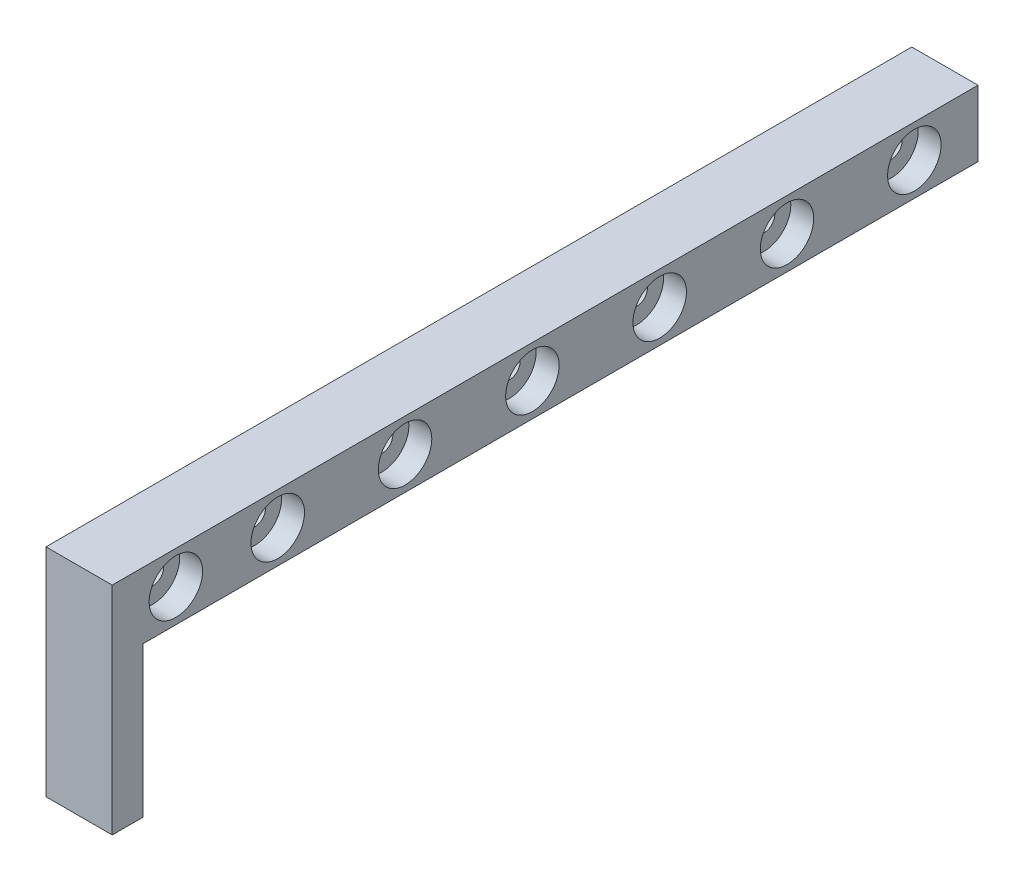
ISO-10303-21;
HEADER;
FILE_DESCRIPTION(('STEP AP214'),'2;1');
FILE_NAME('part.step','',(''),(''),'','','');
FILE_SCHEMA(('AUTOMOTIVE_DESIGN { 1 0 10303 214 1 1 1 1 }'));
ENDSEC;
DATA;
#1=APPLICATION_CONTEXT('core data for automotive mechanical design processes');
#2=APPLICATION_PROTOCOL_DEFINITION('international standard','automotive_design',2000,#1);
#3=PRODUCT_CONTEXT('',#1,'mechanical');
#4=PRODUCT('Part','Part','',(#3));
#5=PRODUCT_RELATED_PRODUCT_CATEGORY('part','',(#4));
#6=PRODUCT_DEFINITION_FORMATION('','',#4);
#7=PRODUCT_DEFINITION_CONTEXT('part definition',#1,'design');
#8=PRODUCT_DEFINITION('design','',#6,#7);
#9=PRODUCT_DEFINITION_SHAPE('','',#8);
#10=(LENGTH_UNIT() NAMED_UNIT(*) SI_UNIT(.MILLI.,.METRE.));
#11=(NAMED_UNIT(*) PLANE_ANGLE_UNIT() SI_UNIT($,.RADIAN.));
#12=(NAMED_UNIT(*) SI_UNIT($,.STERADIAN.) SOLID_ANGLE_UNIT());
#13=UNCERTAINTY_MEASURE_WITH_UNIT(LENGTH_MEASURE(1.E-05),#10,'distance_accuracy_value','');
#14=(GEOMETRIC_REPRESENTATION_CONTEXT(3) GLOBAL_UNCERTAINTY_ASSIGNED_CONTEXT((#13)) GLOBAL_UNIT_ASSIGNED_CONTEXT((#10,
#11,#12)) REPRESENTATION_CONTEXT('',''));
#15=CARTESIAN_POINT('',(0.,0.,0.));
#16=DIRECTION('',(0.,0.,1.));
#17=DIRECTION('',(1.,0.,0.));
#18=AXIS2_PLACEMENT_3D('',#15,#16,#17);
#19=CARTESIAN_POINT('',(-11.5,0.,72.5));
#20=DIRECTION('',(1.,0.,0.));
#21=DIRECTION('',(0.,0.,-1.));
#22=AXIS2_PLACEMENT_3D('',#19,#20,#21);
#23=CYLINDRICAL_SURFACE('',#22,2.1);
#24=CARTESIAN_POINT('',(-6.5,0.,72.5));
#25=DIRECTION('',(1.,0.,0.));
#26=DIRECTION('',(0.,0.,-1.));
#27=AXIS2_PLACEMENT_3D('',#24,#25,#26);
#28=CIRCLE('',#27,2.1);
#29=CARTESIAN_POINT('',(-6.5,0.,70.4));
#30=VERTEX_POINT('',#29);
#31=EDGE_CURVE('E153',#30,#30,#28,.T.);
#32=ORIENTED_EDGE('',*,*,#31,.F.);
#33=EDGE_LOOP('',(#32));
#34=FACE_BOUND('',#33,.T.);
#35=CARTESIAN_POINT('',(2.,0.,72.5));
#36=DIRECTION('',(1.,0.,0.));
#37=DIRECTION('',(0.,0.,-1.));
#38=AXIS2_PLACEMENT_3D('',#35,#36,#37);
#39=CIRCLE('',#38,2.1);
#40=CARTESIAN_POINT('',(2.,0.,70.4));
#41=VERTEX_POINT('',#40);
#42=EDGE_CURVE('E131',#41,#41,#39,.F.);
#43=ORIENTED_EDGE('',*,*,#42,.F.);
#44=EDGE_LOOP('',(#43));
#45=FACE_BOUND('',#44,.T.);
#46=ADVANCED_FACE('F37',(#34,#45),#23,.F.);
#47=CARTESIAN_POINT('',(-11.5,0.,52.5));
#48=DIRECTION('',(1.,0.,0.));
#49=DIRECTION('',(0.,0.,-1.));
#50=AXIS2_PLACEMENT_3D('',#47,#48,#49);
#51=CYLINDRICAL_SURFACE('',#50,2.1);
#52=CARTESIAN_POINT('',(-6.5,0.,52.5));
#53=DIRECTION('',(1.,0.,0.));
#54=DIRECTION('',(0.,0.,-1.));
#55=AXIS2_PLACEMENT_3D('',#52,#53,#54);
#56=CIRCLE('',#55,2.1);
#57=CARTESIAN_POINT('',(-6.5,0.,50.4));
#58=VERTEX_POINT('',#57);
#59=EDGE_CURVE('E157',#58,#58,#56,.T.);
#60=ORIENTED_EDGE('',*,*,#59,.F.);
#61=EDGE_LOOP('',(#60));
#62=FACE_BOUND('',#61,.T.);
#63=CARTESIAN_POINT('',(2.,0.,52.5));
#64=DIRECTION('',(1.,0.,0.));
#65=DIRECTION('',(0.,0.,-1.));
#66=AXIS2_PLACEMENT_3D('',#63,#64,#65);
#67=CIRCLE('',#66,2.1);
#68=CARTESIAN_POINT('',(2.,0.,50.4));
#69=VERTEX_POINT('',#68);
#70=EDGE_CURVE('E128',#69,#69,#67,.F.);
#71=ORIENTED_EDGE('',*,*,#70,.F.);
#72=EDGE_LOOP('',(#71));
#73=FACE_BOUND('',#72,.T.);
#74=ADVANCED_FACE('F235',(#62,#73),#51,.F.);
#75=CARTESIAN_POINT('',(-11.5,0.,27.5));
#76=DIRECTION('',(1.,0.,0.));
#77=DIRECTION('',(0.,0.,-1.));
#78=AXIS2_PLACEMENT_3D('',#75,#76,#77);
#79=CYLINDRICAL_SURFACE('',#78,2.1);
#80=CARTESIAN_POINT('',(-6.5,0.,27.5));
#81=DIRECTION('',(1.,0.,0.));
#82=DIRECTION('',(0.,0.,-1.));
#83=AXIS2_PLACEMENT_3D('',#80,#81,#82);
#84=CIRCLE('',#83,2.1);
#85=CARTESIAN_POINT('',(-6.5,0.,25.4));
#86=VERTEX_POINT('',#85);
#87=EDGE_CURVE('E162',#86,#86,#84,.T.);
#88=ORIENTED_EDGE('',*,*,#87,.F.);
#89=EDGE_LOOP('',(#88));
#90=FACE_BOUND('',#89,.T.);
#91=CARTESIAN_POINT('',(2.,0.,27.5));
#92=DIRECTION('',(1.,0.,0.));
#93=DIRECTION('',(0.,0.,-1.));
#94=AXIS2_PLACEMENT_3D('',#91,#92,#93);
#95=CIRCLE('',#94,2.1);
#96=CARTESIAN_POINT('',(2.,0.,25.4));
#97=VERTEX_POINT('',#96);
#98=EDGE_CURVE('E125',#97,#97,#95,.F.);
#99=ORIENTED_EDGE('',*,*,#98,.F.);
#100=EDGE_LOOP('',(#99));
#101=FACE_BOUND('',#100,.T.);
#102=ADVANCED_FACE('F241',(#90,#101),#79,.F.);
#103=CARTESIAN_POINT('',(-11.5,0.,2.5));
#104=DIRECTION('',(1.,0.,0.));
#105=DIRECTION('',(0.,0.,-1.));
#106=AXIS2_PLACEMENT_3D('',#103,#104,#105);
#107=CYLINDRICAL_SURFACE('',#106,2.1);
#108=CARTESIAN_POINT('',(-6.5,0.,2.5));
#109=DIRECTION('',(1.,0.,0.));
#110=DIRECTION('',(0.,0.,-1.));
#111=AXIS2_PLACEMENT_3D('',#108,#109,#110);
#112=CIRCLE('',#111,2.1);
#113=CARTESIAN_POINT('',(-6.5,0.,0.4));
#114=VERTEX_POINT('',#113);
#115=EDGE_CURVE('E170',#114,#114,#112,.T.);
#116=ORIENTED_EDGE('',*,*,#115,.F.);
#117=EDGE_LOOP('',(#116));
#118=FACE_BOUND('',#117,.T.);
#119=CARTESIAN_POINT('',(2.,0.,2.5));
#120=DIRECTION('',(1.,0.,0.));
#121=DIRECTION('',(0.,0.,-1.));
#122=AXIS2_PLACEMENT_3D('',#119,#120,#121);
#123=CIRCLE('',#122,2.1);
#124=CARTESIAN_POINT('',(2.,0.,0.4));
#125=VERTEX_POINT('',#124);
#126=EDGE_CURVE('E122',#125,#125,#123,.F.);
#127=ORIENTED_EDGE('',*,*,#126,.F.);
#128=EDGE_LOOP('',(#127));
#129=FACE_BOUND('',#128,.T.);
#130=ADVANCED_FACE('F248',(#118,#129),#107,.F.);
#131=CARTESIAN_POINT('',(-11.5,0.,-22.5));
#132=DIRECTION('',(1.,0.,0.));
#133=DIRECTION('',(0.,0.,-1.));
#134=AXIS2_PLACEMENT_3D('',#131,#132,#133);
#135=CYLINDRICAL_SURFACE('',#134,2.1);
#136=CARTESIAN_POINT('',(-6.5,0.,-22.5));
#137=DIRECTION('',(1.,0.,0.));
#138=DIRECTION('',(0.,0.,-1.));
#139=AXIS2_PLACEMENT_3D('',#136,#137,#138);
#140=CIRCLE('',#139,2.1);
#141=CARTESIAN_POINT('',(-6.5,0.,-24.6));
#142=VERTEX_POINT('',#141);
#143=EDGE_CURVE('E173',#142,#142,#140,.T.);
#144=ORIENTED_EDGE('',*,*,#143,.F.);
#145=EDGE_LOOP('',(#144));
#146=FACE_BOUND('',#145,.T.);
#147=CARTESIAN_POINT('',(2.,0.,-22.5));
#148=DIRECTION('',(1.,0.,0.));
#149=DIRECTION('',(0.,0.,-1.));
#150=AXIS2_PLACEMENT_3D('',#147,#148,#149);
#151=CIRCLE('',#150,2.1);
#152=CARTESIAN_POINT('',(2.,0.,-24.6));
#153=VERTEX_POINT('',#152);
#154=EDGE_CURVE('E119',#153,#153,#151,.F.);
#155=ORIENTED_EDGE('',*,*,#154,.F.);
#156=EDGE_LOOP('',(#155));
#157=FACE_BOUND('',#156,.T.);
#158=ADVANCED_FACE('F252',(#146,#157),#135,.F.);
#159=CARTESIAN_POINT('',(-11.5,0.,-47.5));
#160=DIRECTION('',(1.,0.,0.));
#161=DIRECTION('',(0.,0.,-1.));
#162=AXIS2_PLACEMENT_3D('',#159,#160,#161);
#163=CYLINDRICAL_SURFACE('',#162,2.1);
#164=CARTESIAN_POINT('',(-6.5,0.,-47.5));
#165=DIRECTION('',(1.,0.,0.));
#166=DIRECTION('',(0.,0.,-1.));
#167=AXIS2_PLACEMENT_3D('',#164,#165,#166);
#168=CIRCLE('',#167,2.1);
#169=CARTESIAN_POINT('',(-6.5,0.,-49.6));
#170=VERTEX_POINT('',#169);
#171=EDGE_CURVE('E176',#170,#170,#168,.T.);
#172=ORIENTED_EDGE('',*,*,#171,.F.);
#173=EDGE_LOOP('',(#172));
#174=FACE_BOUND('',#173,.T.);
#175=CARTESIAN_POINT('',(2.,0.,-47.5));
#176=DIRECTION('',(1.,0.,0.));
#177=DIRECTION('',(0.,0.,-1.));
#178=AXIS2_PLACEMENT_3D('',#175,#176,#177);
#179=CIRCLE('',#178,2.1);
#180=CARTESIAN_POINT('',(2.,0.,-49.6));
#181=VERTEX_POINT('',#180);
#182=EDGE_CURVE('E115',#181,#181,#179,.F.);
#183=ORIENTED_EDGE('',*,*,#182,.F.);
#184=EDGE_LOOP('',(#183));
#185=FACE_BOUND('',#184,.T.);
#186=ADVANCED_FACE('F256',(#174,#185),#163,.F.);
#187=CARTESIAN_POINT('',(-11.5,0.,-72.5));
#188=DIRECTION('',(1.,0.,0.));
#189=DIRECTION('',(0.,0.,-1.));
#190=AXIS2_PLACEMENT_3D('',#187,#188,#189);
#191=CYLINDRICAL_SURFACE('',#190,2.1);
#192=CARTESIAN_POINT('',(-6.5,0.,-72.5));
#193=DIRECTION('',(1.,0.,0.));
#194=DIRECTION('',(0.,0.,-1.));
#195=AXIS2_PLACEMENT_3D('',#192,#193,#194);
#196=CIRCLE('',#195,2.1);
#197=CARTESIAN_POINT('',(-6.5,0.,-74.6));
#198=VERTEX_POINT('',#197);
#199=EDGE_CURVE('E179',#198,#198,#196,.T.);
#200=ORIENTED_EDGE('',*,*,#199,.F.);
#201=EDGE_LOOP('',(#200));
#202=FACE_BOUND('',#201,.T.);
#203=CARTESIAN_POINT('',(2.,0.,-72.5));
#204=DIRECTION('',(1.,0.,0.));
#205=DIRECTION('',(0.,0.,-1.));
#206=AXIS2_PLACEMENT_3D('',#203,#204,#205);
#207=CIRCLE('',#206,2.1);
#208=CARTESIAN_POINT('',(2.,0.,-74.6));
#209=VERTEX_POINT('',#208);
#210=EDGE_CURVE('E112',#209,#209,#207,.F.);
#211=ORIENTED_EDGE('',*,*,#210,.F.);
#212=EDGE_LOOP('',(#211));
#213=FACE_BOUND('',#212,.T.);
#214=ADVANCED_FACE('F260',(#202,#213),#191,.F.);
#215=CARTESIAN_POINT('',(-6.5,-6.5,85.));
#216=DIRECTION('',(0.,1.,0.));
#217=DIRECTION('',(0.,0.,1.));
#218=AXIS2_PLACEMENT_3D('',#215,#216,#217);
#219=PLANE('',#218);
#220=DIRECTION('',(1.,0.,0.));
#221=VECTOR('',#220,1.);
#222=CARTESIAN_POINT('',(-6.5,-6.5,79.));
#223=LINE('',#222,#221);
#224=CARTESIAN_POINT('',(-6.5,-6.5,79.));
#225=VERTEX_POINT('',#224);
#226=CARTESIAN_POINT('',(6.5,-6.50000000000001,79.));
#227=VERTEX_POINT('',#226);
#228=EDGE_CURVE('E53',#225,#227,#223,.T.);
#229=ORIENTED_EDGE('',*,*,#228,.F.);
#230=DIRECTION('',(0.,0.,-1.));
#231=VECTOR('',#230,1.);
#232=CARTESIAN_POINT('',(-6.5,-6.5,85.));
#233=LINE('',#232,#231);
#234=CARTESIAN_POINT('',(-6.5,-6.5,-85.));
#235=VERTEX_POINT('',#234);
#236=EDGE_CURVE('E11',#225,#235,#233,.T.);
#237=ORIENTED_EDGE('',*,*,#236,.T.);
#238=DIRECTION('',(1.,0.,0.));
#239=VECTOR('',#238,1.);
#240=CARTESIAN_POINT('',(-6.5,-6.5,-85.));
#241=LINE('',#240,#239);
#242=CARTESIAN_POINT('',(6.5,-6.5,-85.));
#243=VERTEX_POINT('',#242);
#244=EDGE_CURVE('E101',#235,#243,#241,.T.);
#245=ORIENTED_EDGE('',*,*,#244,.T.);
#246=DIRECTION('',(0.,0.,-1.));
#247=VECTOR('',#246,1.);
#248=CARTESIAN_POINT('',(6.5,-6.5,85.));
#249=LINE('',#248,#247);
#250=EDGE_CURVE('E46',#227,#243,#249,.T.);
#251=ORIENTED_EDGE('',*,*,#250,.F.);
#252=EDGE_LOOP('',(#229,#237,#245,#251));
#253=FACE_BOUND('',#252,.T.);
#254=ADVANCED_FACE('F208',(#253),#219,.F.);
#255=CARTESIAN_POINT('',(-6.5,6.5,85.));
#256=DIRECTION('',(1.,0.,0.));
#257=DIRECTION('',(0.,0.,-1.));
#258=AXIS2_PLACEMENT_3D('',#255,#256,#257);
#259=PLANE('',#258);
#260=ORIENTED_EDGE('',*,*,#199,.T.);
#261=EDGE_LOOP('',(#260));
#262=FACE_BOUND('',#261,.T.);
#263=ORIENTED_EDGE('',*,*,#171,.T.);
#264=EDGE_LOOP('',(#263));
#265=FACE_BOUND('',#264,.T.);
#266=ORIENTED_EDGE('',*,*,#143,.T.);
#267=EDGE_LOOP('',(#266));
#268=FACE_BOUND('',#267,.T.);
#269=ORIENTED_EDGE('',*,*,#115,.T.);
#270=EDGE_LOOP('',(#269));
#271=FACE_BOUND('',#270,.T.);
#272=ORIENTED_EDGE('',*,*,#87,.T.);
#273=EDGE_LOOP('',(#272));
#274=FACE_BOUND('',#273,.T.);
#275=ORIENTED_EDGE('',*,*,#59,.T.);
#276=EDGE_LOOP('',(#275));
#277=FACE_BOUND('',#276,.T.);
#278=ORIENTED_EDGE('',*,*,#31,.T.);
#279=EDGE_LOOP('',(#278));
#280=FACE_BOUND('',#279,.T.);
#281=DIRECTION('',(0.,0.,-1.));
#282=VECTOR('',#281,1.);
#283=CARTESIAN_POINT('',(-6.5,-36.,85.));
#284=LINE('',#283,#282);
#285=CARTESIAN_POINT('',(-6.5,-36.,85.));
#286=VERTEX_POINT('',#285);
#287=CARTESIAN_POINT('',(-6.5,-36.,79.));
#288=VERTEX_POINT('',#287);
#289=EDGE_CURVE('E104',#286,#288,#284,.T.);
#290=ORIENTED_EDGE('',*,*,#289,.F.);
#291=DIRECTION('',(0.,-1.,0.));
#292=VECTOR('',#291,1.);
#293=CARTESIAN_POINT('',(-6.5,6.5,85.));
#294=LINE('',#293,#292);
#295=CARTESIAN_POINT('',(-6.5,6.5,85.));
#296=VERTEX_POINT('',#295);
#297=EDGE_CURVE('E90',#296,#286,#294,.T.);
#298=ORIENTED_EDGE('',*,*,#297,.F.);
#299=DIRECTION('',(0.,0.,-1.));
#300=VECTOR('',#299,1.);
#301=CARTESIAN_POINT('',(-6.5,6.5,85.));
#302=LINE('',#301,#300);
#303=CARTESIAN_POINT('',(-6.5,6.5,-85.));
#304=VERTEX_POINT('',#303);
#305=EDGE_CURVE('E83',#296,#304,#302,.T.);
#306=ORIENTED_EDGE('',*,*,#305,.T.);
#307=DIRECTION('',(0.,-1.,0.));
#308=VECTOR('',#307,1.);
#309=CARTESIAN_POINT('',(-6.5,6.5,-85.));
#310=LINE('',#309,#308);
#311=EDGE_CURVE('E96',#304,#235,#310,.T.);
#312=ORIENTED_EDGE('',*,*,#311,.T.);
#313=ORIENTED_EDGE('',*,*,#236,.F.);
#314=DIRECTION('',(0.,-1.,0.));
#315=VECTOR('',#314,1.);
#316=CARTESIAN_POINT('',(-6.5,-5.5,79.));
#317=LINE('',#316,#315);
#318=EDGE_CURVE('E182',#225,#288,#317,.T.);
#319=ORIENTED_EDGE('',*,*,#318,.T.);
#320=EDGE_LOOP('',(#290,#298,#306,#312,#313,#319));
#321=FACE_BOUND('',#320,.T.);
#322=ADVANCED_FACE('F39',(#262,#265,#268,#271,#274,#277,#280,#321),#259,.F.);
#323=CARTESIAN_POINT('',(6.5,-6.5,85.));
#324=DIRECTION('',(-1.,0.,0.));
#325=DIRECTION('',(0.,0.,1.));
#326=AXIS2_PLACEMENT_3D('',#323,#324,#325);
#327=PLANE('',#326);
#328=CARTESIAN_POINT('',(6.5,0.,-72.5));
#329=DIRECTION('',(-1.,0.,0.));
#330=DIRECTION('',(0.,0.,1.));
#331=AXIS2_PLACEMENT_3D('',#328,#329,#330);
#332=CIRCLE('',#331,5.25);
#333=CARTESIAN_POINT('',(6.5,0.,-67.25));
#334=VERTEX_POINT('',#333);
#335=EDGE_CURVE('E41',#334,#334,#332,.T.);
#336=ORIENTED_EDGE('',*,*,#335,.T.);
#337=EDGE_LOOP('',(#336));
#338=FACE_BOUND('',#337,.T.);
#339=CARTESIAN_POINT('',(6.5,0.,-47.5));
#340=DIRECTION('',(-1.,0.,0.));
#341=DIRECTION('',(0.,0.,1.));
#342=AXIS2_PLACEMENT_3D('',#339,#340,#341);
#343=CIRCLE('',#342,5.25);
#344=CARTESIAN_POINT('',(6.5,0.,-42.25));
#345=VERTEX_POINT('',#344);
#346=EDGE_CURVE('E148',#345,#345,#343,.T.);
#347=ORIENTED_EDGE('',*,*,#346,.T.);
#348=EDGE_LOOP('',(#347));
#349=FACE_BOUND('',#348,.T.);
#350=CARTESIAN_POINT('',(6.5,0.,-22.5));
#351=DIRECTION('',(-1.,0.,0.));
#352=DIRECTION('',(0.,0.,1.));
#353=AXIS2_PLACEMENT_3D('',#350,#351,#352);
#354=CIRCLE('',#353,5.25);
#355=CARTESIAN_POINT('',(6.5,0.,-17.25));
#356=VERTEX_POINT('',#355);
#357=EDGE_CURVE('E146',#356,#356,#354,.T.);
#358=ORIENTED_EDGE('',*,*,#357,.T.);
#359=EDGE_LOOP('',(#358));
#360=FACE_BOUND('',#359,.T.);
#361=CARTESIAN_POINT('',(6.5,0.,2.5));
#362=DIRECTION('',(-1.,0.,0.));
#363=DIRECTION('',(0.,0.,1.));
#364=AXIS2_PLACEMENT_3D('',#361,#362,#363);
#365=CIRCLE('',#364,5.25);
#366=CARTESIAN_POINT('',(6.5,0.,7.75));
#367=VERTEX_POINT('',#366);
#368=EDGE_CURVE('E143',#367,#367,#365,.T.);
#369=ORIENTED_EDGE('',*,*,#368,.T.);
#370=EDGE_LOOP('',(#369));
#371=FACE_BOUND('',#370,.T.);
#372=CARTESIAN_POINT('',(6.5,0.,27.5));
#373=DIRECTION('',(-1.,0.,0.));
#374=DIRECTION('',(0.,0.,1.));
#375=AXIS2_PLACEMENT_3D('',#372,#373,#374);
#376=CIRCLE('',#375,5.25);
#377=CARTESIAN_POINT('',(6.5,0.,32.75));
#378=VERTEX_POINT('',#377);
#379=EDGE_CURVE('E140',#378,#378,#376,.T.);
#380=ORIENTED_EDGE('',*,*,#379,.T.);
#381=EDGE_LOOP('',(#380));
#382=FACE_BOUND('',#381,.T.);
#383=CARTESIAN_POINT('',(6.5,0.,52.5));
#384=DIRECTION('',(-1.,0.,0.));
#385=DIRECTION('',(0.,0.,1.));
#386=AXIS2_PLACEMENT_3D('',#383,#384,#385);
#387=CIRCLE('',#386,5.25);
#388=CARTESIAN_POINT('',(6.5,0.,57.75));
#389=VERTEX_POINT('',#388);
#390=EDGE_CURVE('E137',#389,#389,#387,.T.);
#391=ORIENTED_EDGE('',*,*,#390,.T.);
#392=EDGE_LOOP('',(#391));
#393=FACE_BOUND('',#392,.T.);
#394=CARTESIAN_POINT('',(6.5,0.,72.5));
#395=DIRECTION('',(-1.,0.,0.));
#396=DIRECTION('',(0.,0.,1.));
#397=AXIS2_PLACEMENT_3D('',#394,#395,#396);
#398=CIRCLE('',#397,5.25);
#399=CARTESIAN_POINT('',(6.5,0.,77.75));
#400=VERTEX_POINT('',#399);
#401=EDGE_CURVE('E134',#400,#400,#398,.T.);
#402=ORIENTED_EDGE('',*,*,#401,.T.);
#403=EDGE_LOOP('',(#402));
#404=FACE_BOUND('',#403,.T.);
#405=DIRECTION('',(0.,0.,-1.));
#406=VECTOR('',#405,1.);
#407=CARTESIAN_POINT('',(6.5,6.5,85.));
#408=LINE('',#407,#406);
#409=CARTESIAN_POINT('',(6.5,6.5,85.));
#410=VERTEX_POINT('',#409);
#411=CARTESIAN_POINT('',(6.5,6.5,-85.));
#412=VERTEX_POINT('',#411);
#413=EDGE_CURVE('E86',#410,#412,#408,.T.);
#414=ORIENTED_EDGE('',*,*,#413,.F.);
#415=DIRECTION('',(0.,1.,0.));
#416=VECTOR('',#415,1.);
#417=CARTESIAN_POINT('',(6.5,-6.5,85.));
#418=LINE('',#417,#416);
#419=CARTESIAN_POINT('',(6.5,-36.,85.));
#420=VERTEX_POINT('',#419);
#421=EDGE_CURVE('E199',#420,#410,#418,.T.);
#422=ORIENTED_EDGE('',*,*,#421,.F.);
#423=DIRECTION('',(0.,0.,-1.));
#424=VECTOR('',#423,1.);
#425=CARTESIAN_POINT('',(6.5,-36.,85.));
#426=LINE('',#425,#424);
#427=CARTESIAN_POINT('',(6.5,-36.,79.));
#428=VERTEX_POINT('',#427);
#429=EDGE_CURVE('E186',#420,#428,#426,.T.);
#430=ORIENTED_EDGE('',*,*,#429,.T.);
#431=DIRECTION('',(0.,1.,0.));
#432=VECTOR('',#431,1.);
#433=CARTESIAN_POINT('',(6.5,-36.,79.));
#434=LINE('',#433,#432);
#435=EDGE_CURVE('E187',#428,#227,#434,.T.);
#436=ORIENTED_EDGE('',*,*,#435,.T.);
#437=ORIENTED_EDGE('',*,*,#250,.T.);
#438=DIRECTION('',(0.,1.,0.));
#439=VECTOR('',#438,1.);
#440=CARTESIAN_POINT('',(6.5,-6.5,-85.));
#441=LINE('',#440,#439);
#442=EDGE_CURVE('E91',#243,#412,#441,.T.);
#443=ORIENTED_EDGE('',*,*,#442,.T.);
#444=EDGE_LOOP('',(#414,#422,#430,#436,#437,#443));
#445=FACE_BOUND('',#444,.T.);
#446=ADVANCED_FACE('F206',(#338,#349,#360,#371,#382,#393,#404,#445),#327,.F.);
#447=CARTESIAN_POINT('',(6.5,6.5,85.));
#448=DIRECTION('',(0.,-1.,0.));
#449=DIRECTION('',(0.,0.,-1.));
#450=AXIS2_PLACEMENT_3D('',#447,#448,#449);
#451=PLANE('',#450);
#452=DIRECTION('',(-1.,0.,0.));
#453=VECTOR('',#452,1.);
#454=CARTESIAN_POINT('',(6.5,6.5,-85.));
#455=LINE('',#454,#453);
#456=EDGE_CURVE('E80',#412,#304,#455,.T.);
#457=ORIENTED_EDGE('',*,*,#456,.T.);
#458=ORIENTED_EDGE('',*,*,#305,.F.);
#459=DIRECTION('',(-1.,0.,0.));
#460=VECTOR('',#459,1.);
#461=CARTESIAN_POINT('',(6.5,6.5,85.));
#462=LINE('',#461,#460);
#463=EDGE_CURVE('E62',#410,#296,#462,.T.);
#464=ORIENTED_EDGE('',*,*,#463,.F.);
#465=ORIENTED_EDGE('',*,*,#413,.T.);
#466=EDGE_LOOP('',(#457,#458,#464,#465));
#467=FACE_BOUND('',#466,.T.);
#468=ADVANCED_FACE('F82',(#467),#451,.F.);
#469=CARTESIAN_POINT('',(0.,0.,85.));
#470=DIRECTION('',(0.,0.,1.));
#471=DIRECTION('',(1.,0.,0.));
#472=AXIS2_PLACEMENT_3D('',#469,#470,#471);
#473=PLANE('',#472);
#474=ORIENTED_EDGE('',*,*,#421,.T.);
#475=ORIENTED_EDGE('',*,*,#463,.T.);
#476=ORIENTED_EDGE('',*,*,#297,.T.);
#477=DIRECTION('',(1.,0.,0.));
#478=VECTOR('',#477,1.);
#479=CARTESIAN_POINT('',(-6.5,-36.,85.));
#480=LINE('',#479,#478);
#481=EDGE_CURVE('E183',#286,#420,#480,.T.);
#482=ORIENTED_EDGE('',*,*,#481,.T.);
#483=EDGE_LOOP('',(#474,#475,#476,#482));
#484=FACE_BOUND('',#483,.T.);
#485=ADVANCED_FACE('F201',(#484),#473,.T.);
#486=CARTESIAN_POINT('',(0.,0.,-85.));
#487=DIRECTION('',(0.,0.,1.));
#488=DIRECTION('',(1.,0.,0.));
#489=AXIS2_PLACEMENT_3D('',#486,#487,#488);
#490=PLANE('',#489);
#491=ORIENTED_EDGE('',*,*,#311,.F.);
#492=ORIENTED_EDGE('',*,*,#456,.F.);
#493=ORIENTED_EDGE('',*,*,#442,.F.);
#494=ORIENTED_EDGE('',*,*,#244,.F.);
#495=EDGE_LOOP('',(#491,#492,#493,#494));
#496=FACE_BOUND('',#495,.T.);
#497=ADVANCED_FACE('F99',(#496),#490,.F.);
#498=CARTESIAN_POINT('',(0.,0.,79.));
#499=DIRECTION('',(0.,0.,1.));
#500=DIRECTION('',(1.,0.,0.));
#501=AXIS2_PLACEMENT_3D('',#498,#499,#500);
#502=PLANE('',#501);
#503=ORIENTED_EDGE('',*,*,#318,.F.);
#504=ORIENTED_EDGE('',*,*,#228,.T.);
#505=ORIENTED_EDGE('',*,*,#435,.F.);
#506=DIRECTION('',(1.,0.,0.));
#507=VECTOR('',#506,1.);
#508=CARTESIAN_POINT('',(-6.5,-36.,79.));
#509=LINE('',#508,#507);
#510=EDGE_CURVE('E190',#288,#428,#509,.T.);
#511=ORIENTED_EDGE('',*,*,#510,.F.);
#512=EDGE_LOOP('',(#503,#504,#505,#511));
#513=FACE_BOUND('',#512,.T.);
#514=ADVANCED_FACE('F213',(#513),#502,.F.);
#515=CARTESIAN_POINT('',(-6.5,-36.,85.));
#516=DIRECTION('',(0.,1.,0.));
#517=DIRECTION('',(0.,0.,1.));
#518=AXIS2_PLACEMENT_3D('',#515,#516,#517);
#519=PLANE('',#518);
#520=ORIENTED_EDGE('',*,*,#510,.T.);
#521=ORIENTED_EDGE('',*,*,#429,.F.);
#522=ORIENTED_EDGE('',*,*,#481,.F.);
#523=ORIENTED_EDGE('',*,*,#289,.T.);
#524=EDGE_LOOP('',(#520,#521,#522,#523));
#525=FACE_BOUND('',#524,.T.);
#526=ADVANCED_FACE('F217',(#525),#519,.F.);
#527=CARTESIAN_POINT('',(2.,0.,-72.5));
#528=DIRECTION('',(1.,0.,0.));
#529=DIRECTION('',(0.,0.,-1.));
#530=AXIS2_PLACEMENT_3D('',#527,#528,#529);
#531=CYLINDRICAL_SURFACE('',#530,5.25);
#532=CARTESIAN_POINT('',(2.,0.,-72.5));
#533=DIRECTION('',(1.,0.,0.));
#534=DIRECTION('',(0.,0.,-1.));
#535=AXIS2_PLACEMENT_3D('',#532,#533,#534);
#536=CIRCLE('',#535,5.25);
#537=CARTESIAN_POINT('',(2.,0.,-77.75));
#538=VERTEX_POINT('',#537);
#539=EDGE_CURVE('E116',#538,#538,#536,.T.);
#540=ORIENTED_EDGE('',*,*,#539,.F.);
#541=EDGE_LOOP('',(#540));
#542=FACE_BOUND('',#541,.T.);
#543=ORIENTED_EDGE('',*,*,#335,.F.);
#544=EDGE_LOOP('',(#543));
#545=FACE_BOUND('',#544,.T.);
#546=ADVANCED_FACE('F223',(#542,#545),#531,.F.);
#547=CARTESIAN_POINT('',(2.,0.,-72.5));
#548=DIRECTION('',(1.,0.,0.));
#549=DIRECTION('',(0.,0.,-1.));
#550=AXIS2_PLACEMENT_3D('',#547,#548,#549);
#551=PLANE('',#550);
#552=ORIENTED_EDGE('',*,*,#539,.T.);
#553=EDGE_LOOP('',(#552));
#554=FACE_BOUND('',#553,.T.);
#555=ORIENTED_EDGE('',*,*,#210,.T.);
#556=EDGE_LOOP('',(#555));
#557=FACE_BOUND('',#556,.T.);
#558=ADVANCED_FACE('F229',(#554,#557),#551,.T.);
#559=CARTESIAN_POINT('',(2.,0.,-47.5));
#560=DIRECTION('',(1.,0.,0.));
#561=DIRECTION('',(0.,0.,-1.));
#562=AXIS2_PLACEMENT_3D('',#559,#560,#561);
#563=CYLINDRICAL_SURFACE('',#562,5.25);
#564=CARTESIAN_POINT('',(2.,0.,-47.5));
#565=DIRECTION('',(1.,0.,0.));
#566=DIRECTION('',(0.,0.,-1.));
#567=AXIS2_PLACEMENT_3D('',#564,#565,#566);
#568=CIRCLE('',#567,5.25);
#569=CARTESIAN_POINT('',(2.,0.,-52.75));
#570=VERTEX_POINT('',#569);
#571=EDGE_CURVE('E322',#570,#570,#568,.T.);
#572=ORIENTED_EDGE('',*,*,#571,.F.);
#573=EDGE_LOOP('',(#572));
#574=FACE_BOUND('',#573,.T.);
#575=ORIENTED_EDGE('',*,*,#346,.F.);
#576=EDGE_LOOP('',(#575));
#577=FACE_BOUND('',#576,.T.);
#578=ADVANCED_FACE('F308',(#574,#577),#563,.F.);
#579=CARTESIAN_POINT('',(2.,0.,-47.5));
#580=DIRECTION('',(1.,0.,0.));
#581=DIRECTION('',(0.,0.,-1.));
#582=AXIS2_PLACEMENT_3D('',#579,#580,#581);
#583=PLANE('',#582);
#584=ORIENTED_EDGE('',*,*,#571,.T.);
#585=EDGE_LOOP('',(#584));
#586=FACE_BOUND('',#585,.T.);
#587=ORIENTED_EDGE('',*,*,#182,.T.);
#588=EDGE_LOOP('',(#587));
#589=FACE_BOUND('',#588,.T.);
#590=ADVANCED_FACE('F304',(#586,#589),#583,.T.);
#591=CARTESIAN_POINT('',(2.,0.,-22.5));
#592=DIRECTION('',(1.,0.,0.));
#593=DIRECTION('',(0.,0.,-1.));
#594=AXIS2_PLACEMENT_3D('',#591,#592,#593);
#595=CYLINDRICAL_SURFACE('',#594,5.25);
#596=CARTESIAN_POINT('',(2.,0.,-22.5));
#597=DIRECTION('',(1.,0.,0.));
#598=DIRECTION('',(0.,0.,-1.));
#599=AXIS2_PLACEMENT_3D('',#596,#597,#598);
#600=CIRCLE('',#599,5.25);
#601=CARTESIAN_POINT('',(2.,0.,-27.75));
#602=VERTEX_POINT('',#601);
#603=EDGE_CURVE('E325',#602,#602,#600,.T.);
#604=ORIENTED_EDGE('',*,*,#603,.F.);
#605=EDGE_LOOP('',(#604));
#606=FACE_BOUND('',#605,.T.);
#607=ORIENTED_EDGE('',*,*,#357,.F.);
#608=EDGE_LOOP('',(#607));
#609=FACE_BOUND('',#608,.T.);
#610=ADVANCED_FACE('F300',(#606,#609),#595,.F.);
#611=CARTESIAN_POINT('',(2.,0.,-22.5));
#612=DIRECTION('',(1.,0.,0.));
#613=DIRECTION('',(0.,0.,-1.));
#614=AXIS2_PLACEMENT_3D('',#611,#612,#613);
#615=PLANE('',#614);
#616=ORIENTED_EDGE('',*,*,#603,.T.);
#617=EDGE_LOOP('',(#616));
#618=FACE_BOUND('',#617,.T.);
#619=ORIENTED_EDGE('',*,*,#154,.T.);
#620=EDGE_LOOP('',(#619));
#621=FACE_BOUND('',#620,.T.);
#622=ADVANCED_FACE('F296',(#618,#621),#615,.T.);
#623=CARTESIAN_POINT('',(2.,0.,2.5));
#624=DIRECTION('',(1.,0.,0.));
#625=DIRECTION('',(0.,0.,-1.));
#626=AXIS2_PLACEMENT_3D('',#623,#624,#625);
#627=CYLINDRICAL_SURFACE('',#626,5.25);
#628=CARTESIAN_POINT('',(2.,0.,2.5));
#629=DIRECTION('',(1.,0.,0.));
#630=DIRECTION('',(0.,0.,-1.));
#631=AXIS2_PLACEMENT_3D('',#628,#629,#630);
#632=CIRCLE('',#631,5.25);
#633=CARTESIAN_POINT('',(2.,0.,-2.75));
#634=VERTEX_POINT('',#633);
#635=EDGE_CURVE('E330',#634,#634,#632,.T.);
#636=ORIENTED_EDGE('',*,*,#635,.F.);
#637=EDGE_LOOP('',(#636));
#638=FACE_BOUND('',#637,.T.);
#639=ORIENTED_EDGE('',*,*,#368,.F.);
#640=EDGE_LOOP('',(#639));
#641=FACE_BOUND('',#640,.T.);
#642=ADVANCED_FACE('F292',(#638,#641),#627,.F.);
#643=CARTESIAN_POINT('',(2.,0.,2.5));
#644=DIRECTION('',(1.,0.,0.));
#645=DIRECTION('',(0.,0.,-1.));
#646=AXIS2_PLACEMENT_3D('',#643,#644,#645);
#647=PLANE('',#646);
#648=ORIENTED_EDGE('',*,*,#635,.T.);
#649=EDGE_LOOP('',(#648));
#650=FACE_BOUND('',#649,.T.);
#651=ORIENTED_EDGE('',*,*,#126,.T.);
#652=EDGE_LOOP('',(#651));
#653=FACE_BOUND('',#652,.T.);
#654=ADVANCED_FACE('F288',(#650,#653),#647,.T.);
#655=CARTESIAN_POINT('',(2.,0.,27.5));
#656=DIRECTION('',(1.,0.,0.));
#657=DIRECTION('',(0.,0.,-1.));
#658=AXIS2_PLACEMENT_3D('',#655,#656,#657);
#659=CYLINDRICAL_SURFACE('',#658,5.25);
#660=CARTESIAN_POINT('',(2.,0.,27.5));
#661=DIRECTION('',(1.,0.,0.));
#662=DIRECTION('',(0.,0.,-1.));
#663=AXIS2_PLACEMENT_3D('',#660,#661,#662);
#664=CIRCLE('',#663,5.25);
#665=CARTESIAN_POINT('',(2.,0.,22.25));
#666=VERTEX_POINT('',#665);
#667=EDGE_CURVE('E333',#666,#666,#664,.T.);
#668=ORIENTED_EDGE('',*,*,#667,.F.);
#669=EDGE_LOOP('',(#668));
#670=FACE_BOUND('',#669,.T.);
#671=ORIENTED_EDGE('',*,*,#379,.F.);
#672=EDGE_LOOP('',(#671));
#673=FACE_BOUND('',#672,.T.);
#674=ADVANCED_FACE('F284',(#670,#673),#659,.F.);
#675=CARTESIAN_POINT('',(2.,0.,27.5));
#676=DIRECTION('',(1.,0.,0.));
#677=DIRECTION('',(0.,0.,-1.));
#678=AXIS2_PLACEMENT_3D('',#675,#676,#677);
#679=PLANE('',#678);
#680=ORIENTED_EDGE('',*,*,#667,.T.);
#681=EDGE_LOOP('',(#680));
#682=FACE_BOUND('',#681,.T.);
#683=ORIENTED_EDGE('',*,*,#98,.T.);
#684=EDGE_LOOP('',(#683));
#685=FACE_BOUND('',#684,.T.);
#686=ADVANCED_FACE('F280',(#682,#685),#679,.T.);
#687=CARTESIAN_POINT('',(2.,0.,52.5));
#688=DIRECTION('',(1.,0.,0.));
#689=DIRECTION('',(0.,0.,-1.));
#690=AXIS2_PLACEMENT_3D('',#687,#688,#689);
#691=CYLINDRICAL_SURFACE('',#690,5.25);
#692=CARTESIAN_POINT('',(2.,0.,52.5));
#693=DIRECTION('',(1.,0.,0.));
#694=DIRECTION('',(0.,0.,-1.));
#695=AXIS2_PLACEMENT_3D('',#692,#693,#694);
#696=CIRCLE('',#695,5.25);
#697=CARTESIAN_POINT('',(2.,0.,47.25));
#698=VERTEX_POINT('',#697);
#699=EDGE_CURVE('E335',#698,#698,#696,.T.);
#700=ORIENTED_EDGE('',*,*,#699,.F.);
#701=EDGE_LOOP('',(#700));
#702=FACE_BOUND('',#701,.T.);
#703=ORIENTED_EDGE('',*,*,#390,.F.);
#704=EDGE_LOOP('',(#703));
#705=FACE_BOUND('',#704,.T.);
#706=ADVANCED_FACE('F276',(#702,#705),#691,.F.);
#707=CARTESIAN_POINT('',(2.,0.,52.5));
#708=DIRECTION('',(1.,0.,0.));
#709=DIRECTION('',(0.,0.,-1.));
#710=AXIS2_PLACEMENT_3D('',#707,#708,#709);
#711=PLANE('',#710);
#712=ORIENTED_EDGE('',*,*,#699,.T.);
#713=EDGE_LOOP('',(#712));
#714=FACE_BOUND('',#713,.T.);
#715=ORIENTED_EDGE('',*,*,#70,.T.);
#716=EDGE_LOOP('',(#715));
#717=FACE_BOUND('',#716,.T.);
#718=ADVANCED_FACE('F272',(#714,#717),#711,.T.);
#719=CARTESIAN_POINT('',(2.,0.,72.5));
#720=DIRECTION('',(1.,0.,0.));
#721=DIRECTION('',(0.,0.,-1.));
#722=AXIS2_PLACEMENT_3D('',#719,#720,#721);
#723=CYLINDRICAL_SURFACE('',#722,5.25);
#724=CARTESIAN_POINT('',(2.,0.,72.5));
#725=DIRECTION('',(1.,0.,0.));
#726=DIRECTION('',(0.,0.,-1.));
#727=AXIS2_PLACEMENT_3D('',#724,#725,#726);
#728=CIRCLE('',#727,5.25);
#729=CARTESIAN_POINT('',(2.,0.,67.25));
#730=VERTEX_POINT('',#729);
#731=EDGE_CURVE('E165',#730,#730,#728,.T.);
#732=ORIENTED_EDGE('',*,*,#731,.F.);
#733=EDGE_LOOP('',(#732));
#734=FACE_BOUND('',#733,.T.);
#735=ORIENTED_EDGE('',*,*,#401,.F.);
#736=EDGE_LOOP('',(#735));
#737=FACE_BOUND('',#736,.T.);
#738=ADVANCED_FACE('F268',(#734,#737),#723,.F.);
#739=CARTESIAN_POINT('',(2.,0.,72.5));
#740=DIRECTION('',(1.,0.,0.));
#741=DIRECTION('',(0.,0.,-1.));
#742=AXIS2_PLACEMENT_3D('',#739,#740,#741);
#743=PLANE('',#742);
#744=ORIENTED_EDGE('',*,*,#731,.T.);
#745=EDGE_LOOP('',(#744));
#746=FACE_BOUND('',#745,.T.);
#747=ORIENTED_EDGE('',*,*,#42,.T.);
#748=EDGE_LOOP('',(#747));
#749=FACE_BOUND('',#748,.T.);
#750=ADVANCED_FACE('F265',(#746,#749),#743,.T.);
#751=CLOSED_SHELL('',(#46,#74,#102,#130,#158,#186,#214,#254,#322,#446,#468,#485,#497,#514,#526,
#546,#558,#578,#590,#610,#622,#642,#654,#674,#686,#706,#718,#738,#750));
#752=MANIFOLD_SOLID_BREP('B2',#751);
#753=ADVANCED_BREP_SHAPE_REPRESENTATION('',(#18,#752),#14);
#754=SHAPE_DEFINITION_REPRESENTATION(#9,#753);
ENDSEC;
END-ISO-10303-21;
